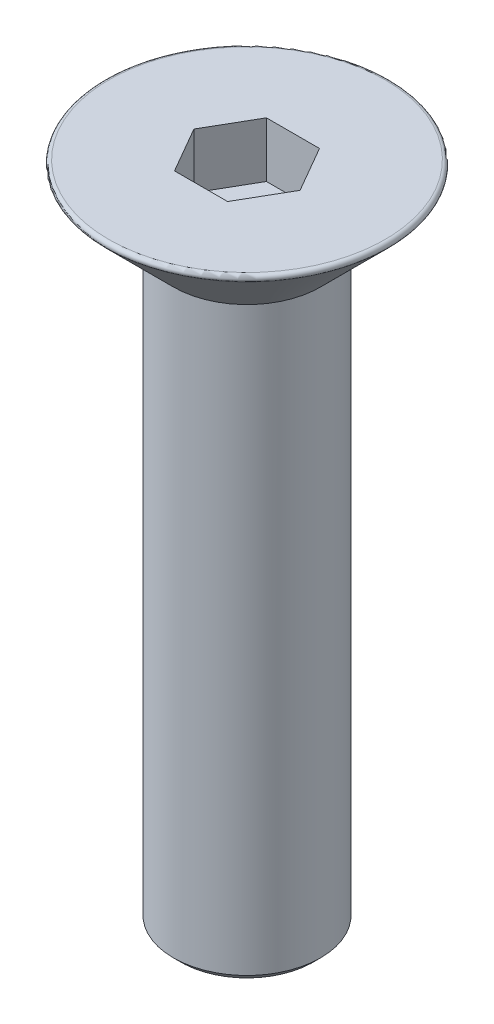
ISO-10303-21;
HEADER;
FILE_DESCRIPTION(('STEP AP214'),'2;1');
FILE_NAME('part.step','',(''),(''),'','','');
FILE_SCHEMA(('AUTOMOTIVE_DESIGN { 1 0 10303 214 1 1 1 1 }'));
ENDSEC;
DATA;
#1=APPLICATION_CONTEXT('core data for automotive mechanical design processes');
#2=APPLICATION_PROTOCOL_DEFINITION('international standard','automotive_design',2000,#1);
#3=PRODUCT_CONTEXT('',#1,'mechanical');
#4=PRODUCT('Part','Part','',(#3));
#5=PRODUCT_RELATED_PRODUCT_CATEGORY('part','',(#4));
#6=PRODUCT_DEFINITION_FORMATION('','',#4);
#7=PRODUCT_DEFINITION_CONTEXT('part definition',#1,'design');
#8=PRODUCT_DEFINITION('design','',#6,#7);
#9=PRODUCT_DEFINITION_SHAPE('','',#8);
#10=(LENGTH_UNIT() NAMED_UNIT(*) SI_UNIT(.MILLI.,.METRE.));
#11=(NAMED_UNIT(*) PLANE_ANGLE_UNIT() SI_UNIT($,.RADIAN.));
#12=(NAMED_UNIT(*) SI_UNIT($,.STERADIAN.) SOLID_ANGLE_UNIT());
#13=UNCERTAINTY_MEASURE_WITH_UNIT(LENGTH_MEASURE(1.E-05),#10,'distance_accuracy_value','');
#14=(GEOMETRIC_REPRESENTATION_CONTEXT(3) GLOBAL_UNCERTAINTY_ASSIGNED_CONTEXT((#13)) GLOBAL_UNIT_ASSIGNED_CONTEXT((#10,
#11,#12)) REPRESENTATION_CONTEXT('',''));
#15=CARTESIAN_POINT('',(0.,0.,0.));
#16=DIRECTION('',(0.,0.,1.));
#17=DIRECTION('',(1.,0.,0.));
#18=AXIS2_PLACEMENT_3D('',#15,#16,#17);
#19=CARTESIAN_POINT('',(0.,0.,0.));
#20=DIRECTION('',(0.,-1.,0.));
#21=DIRECTION('',(0.,0.,-1.));
#22=AXIS2_PLACEMENT_3D('',#19,#20,#21);
#23=PLANE('',#22);
#24=CARTESIAN_POINT('',(0.,0.,0.));
#25=DIRECTION('',(0.,-1.,0.));
#26=DIRECTION('',(0.,0.,-1.));
#27=AXIS2_PLACEMENT_3D('',#24,#25,#26);
#28=CIRCLE('',#27,1.8);
#29=CARTESIAN_POINT('',(0.,0.,-1.8));
#30=VERTEX_POINT('',#29);
#31=EDGE_CURVE('E11',#30,#30,#28,.T.);
#32=ORIENTED_EDGE('',*,*,#31,.T.);
#33=EDGE_LOOP('',(#32));
#34=FACE_BOUND('',#33,.T.);
#35=ADVANCED_FACE('F17',(#34),#23,.T.);
#36=CARTESIAN_POINT('',(0.,50.9004739336492,0.));
#37=DIRECTION('',(0.,1.,0.));
#38=DIRECTION('',(0.,0.,1.));
#39=AXIS2_PLACEMENT_3D('',#36,#37,#38);
#40=CYLINDRICAL_SURFACE('',#39,2.);
#41=CARTESIAN_POINT('',(0.,0.2,0.));
#42=DIRECTION('',(0.,-1.,0.));
#43=DIRECTION('',(0.,0.,-1.));
#44=AXIS2_PLACEMENT_3D('',#41,#42,#43);
#45=CIRCLE('',#44,2.);
#46=CARTESIAN_POINT('',(0.,0.2,-2.));
#47=VERTEX_POINT('',#46);
#48=EDGE_CURVE('E25',#47,#47,#45,.F.);
#49=ORIENTED_EDGE('',*,*,#48,.T.);
#50=EDGE_LOOP('',(#49));
#51=FACE_BOUND('',#50,.T.);
#52=CARTESIAN_POINT('',(0.,16.,0.));
#53=DIRECTION('',(0.,1.,0.));
#54=DIRECTION('',(0.,0.,1.));
#55=AXIS2_PLACEMENT_3D('',#52,#53,#54);
#56=CIRCLE('',#55,2.);
#57=CARTESIAN_POINT('',(0.,16.,2.));
#58=VERTEX_POINT('',#57);
#59=EDGE_CURVE('E119',#58,#58,#56,.T.);
#60=ORIENTED_EDGE('',*,*,#59,.F.);
#61=EDGE_LOOP('',(#60));
#62=FACE_BOUND('',#61,.T.);
#63=ADVANCED_FACE('F135',(#51,#62),#40,.T.);
#64=CARTESIAN_POINT('',(0.,18.,0.));
#65=DIRECTION('',(0.,1.,0.));
#66=DIRECTION('',(0.,0.,1.));
#67=AXIS2_PLACEMENT_3D('',#64,#65,#66);
#68=CONICAL_SURFACE('',#67,4.,0.78539816339745);
#69=CARTESIAN_POINT('',(0.,17.8292893218814,0.));
#70=DIRECTION('',(0.,-1.,0.));
#71=DIRECTION('',(0.,0.,-1.));
#72=AXIS2_PLACEMENT_3D('',#69,#70,#71);
#73=CIRCLE('',#72,3.82928932188134);
#74=CARTESIAN_POINT('',(0.,17.8292893218814,-3.82928932188134));
#75=VERTEX_POINT('',#74);
#76=EDGE_CURVE('E130',#75,#75,#73,.T.);
#77=ORIENTED_EDGE('',*,*,#76,.T.);
#78=EDGE_LOOP('',(#77));
#79=FACE_BOUND('',#78,.T.);
#80=ORIENTED_EDGE('',*,*,#59,.T.);
#81=EDGE_LOOP('',(#80));
#82=FACE_BOUND('',#81,.T.);
#83=ADVANCED_FACE('F160',(#79,#82),#68,.T.);
#84=CARTESIAN_POINT('',(-4.,18.,0.));
#85=DIRECTION('',(0.,1.,0.));
#86=DIRECTION('',(0.,0.,1.));
#87=AXIS2_PLACEMENT_3D('',#84,#85,#86);
#88=PLANE('',#87);
#89=DIRECTION('',(0.5,0.,-0.866025403784439));
#90=VECTOR('',#89,1.);
#91=CARTESIAN_POINT('',(0.721687836487033,18.,1.25));
#92=LINE('',#91,#90);
#93=CARTESIAN_POINT('',(0.721687836487033,18.,1.25));
#94=VERTEX_POINT('',#93);
#95=CARTESIAN_POINT('',(1.44337567297407,18.,0.));
#96=VERTEX_POINT('',#95);
#97=EDGE_CURVE('E32',#94,#96,#92,.T.);
#98=ORIENTED_EDGE('',*,*,#97,.F.);
#99=DIRECTION('',(1.,0.,0.));
#100=VECTOR('',#99,1.);
#101=CARTESIAN_POINT('',(-0.721687836487033,18.,1.25));
#102=LINE('',#101,#100);
#103=CARTESIAN_POINT('',(-0.721687836487033,18.,1.25));
#104=VERTEX_POINT('',#103);
#105=EDGE_CURVE('E115',#104,#94,#102,.T.);
#106=ORIENTED_EDGE('',*,*,#105,.F.);
#107=DIRECTION('',(0.5,0.,0.866025403784439));
#108=VECTOR('',#107,1.);
#109=CARTESIAN_POINT('',(-1.44337567297406,18.,0.));
#110=LINE('',#109,#108);
#111=CARTESIAN_POINT('',(-1.44337567297406,18.,0.));
#112=VERTEX_POINT('',#111);
#113=EDGE_CURVE('E113',#112,#104,#110,.T.);
#114=ORIENTED_EDGE('',*,*,#113,.F.);
#115=DIRECTION('',(-0.5,0.,0.866025403784439));
#116=VECTOR('',#115,1.);
#117=CARTESIAN_POINT('',(-0.721687836487033,18.,-1.25));
#118=LINE('',#117,#116);
#119=CARTESIAN_POINT('',(-0.721687836487033,18.,-1.25));
#120=VERTEX_POINT('',#119);
#121=EDGE_CURVE('E80',#120,#112,#118,.T.);
#122=ORIENTED_EDGE('',*,*,#121,.F.);
#123=DIRECTION('',(-1.,0.,0.));
#124=VECTOR('',#123,1.);
#125=CARTESIAN_POINT('',(0.721687836487032,18.,-1.25));
#126=LINE('',#125,#124);
#127=CARTESIAN_POINT('',(0.721687836487032,18.,-1.25));
#128=VERTEX_POINT('',#127);
#129=EDGE_CURVE('E109',#128,#120,#126,.T.);
#130=ORIENTED_EDGE('',*,*,#129,.F.);
#131=DIRECTION('',(-0.5,0.,-0.866025403784439));
#132=VECTOR('',#131,1.);
#133=CARTESIAN_POINT('',(1.44337567297406,18.,0.));
#134=LINE('',#133,#132);
#135=EDGE_CURVE('E106',#96,#128,#134,.T.);
#136=ORIENTED_EDGE('',*,*,#135,.F.);
#137=EDGE_LOOP('',(#98,#106,#114,#122,#130,#136));
#138=FACE_BOUND('',#137,.T.);
#139=CARTESIAN_POINT('',(0.,18.,0.));
#140=DIRECTION('',(0.,1.,0.));
#141=DIRECTION('',(0.,0.,1.));
#142=AXIS2_PLACEMENT_3D('',#139,#140,#141);
#143=CIRCLE('',#142,3.75857864376268);
#144=CARTESIAN_POINT('',(0.,18.,3.75857864376268));
#145=VERTEX_POINT('',#144);
#146=EDGE_CURVE('E127',#145,#145,#143,.T.);
#147=ORIENTED_EDGE('',*,*,#146,.T.);
#148=EDGE_LOOP('',(#147));
#149=FACE_BOUND('',#148,.T.);
#150=ADVANCED_FACE('F150',(#138,#149),#88,.T.);
#151=CARTESIAN_POINT('',(0.,17.9,0.));
#152=DIRECTION('',(0.,1.,0.));
#153=DIRECTION('',(0.,0.,1.));
#154=AXIS2_PLACEMENT_3D('',#151,#152,#153);
#155=TOROIDAL_SURFACE('',#154,3.75857864376268,0.1);
#156=ORIENTED_EDGE('',*,*,#76,.F.);
#157=EDGE_LOOP('',(#156));
#158=FACE_BOUND('',#157,.T.);
#159=ORIENTED_EDGE('',*,*,#146,.F.);
#160=EDGE_LOOP('',(#159));
#161=FACE_BOUND('',#160,.T.);
#162=ADVANCED_FACE('F140',(#158,#161),#155,.T.);
#163=CARTESIAN_POINT('',(0.,0.2,0.));
#164=DIRECTION('',(0.,1.,0.));
#165=DIRECTION('',(0.,0.,1.));
#166=AXIS2_PLACEMENT_3D('',#163,#164,#165);
#167=CONICAL_SURFACE('',#166,2.,0.785398163397455);
#168=ORIENTED_EDGE('',*,*,#31,.F.);
#169=EDGE_LOOP('',(#168));
#170=FACE_BOUND('',#169,.T.);
#171=ORIENTED_EDGE('',*,*,#48,.F.);
#172=EDGE_LOOP('',(#171));
#173=FACE_BOUND('',#172,.T.);
#174=ADVANCED_FACE('F19',(#170,#173),#167,.T.);
#175=CARTESIAN_POINT('',(0.721687836487033,16.5,1.25));
#176=DIRECTION('',(0.866025403784439,0.,0.5));
#177=DIRECTION('',(0.5,0.,-0.866025403784439));
#178=AXIS2_PLACEMENT_3D('',#175,#176,#177);
#179=PLANE('',#178);
#180=ORIENTED_EDGE('',*,*,#97,.T.);
#181=DIRECTION('',(0.,1.,0.));
#182=VECTOR('',#181,1.);
#183=CARTESIAN_POINT('',(1.44337567297406,16.5,0.));
#184=LINE('',#183,#182);
#185=CARTESIAN_POINT('',(1.44337567297406,16.5,0.));
#186=VERTEX_POINT('',#185);
#187=EDGE_CURVE('E62',#186,#96,#184,.T.);
#188=ORIENTED_EDGE('',*,*,#187,.F.);
#189=DIRECTION('',(0.5,0.,-0.866025403784439));
#190=VECTOR('',#189,1.);
#191=CARTESIAN_POINT('',(0.721687836487033,16.5,1.25));
#192=LINE('',#191,#190);
#193=CARTESIAN_POINT('',(0.721687836487033,16.5,1.25));
#194=VERTEX_POINT('',#193);
#195=EDGE_CURVE('E117',#194,#186,#192,.T.);
#196=ORIENTED_EDGE('',*,*,#195,.F.);
#197=DIRECTION('',(0.,1.,0.));
#198=VECTOR('',#197,1.);
#199=CARTESIAN_POINT('',(0.721687836487033,16.5,1.25));
#200=LINE('',#199,#198);
#201=EDGE_CURVE('E40',#194,#94,#200,.T.);
#202=ORIENTED_EDGE('',*,*,#201,.T.);
#203=EDGE_LOOP('',(#180,#188,#196,#202));
#204=FACE_BOUND('',#203,.T.);
#205=ADVANCED_FACE('F139',(#204),#179,.F.);
#206=CARTESIAN_POINT('',(-0.721687836487033,16.5,1.25));
#207=DIRECTION('',(0.,0.,1.));
#208=DIRECTION('',(1.,0.,0.));
#209=AXIS2_PLACEMENT_3D('',#206,#207,#208);
#210=PLANE('',#209);
#211=ORIENTED_EDGE('',*,*,#105,.T.);
#212=ORIENTED_EDGE('',*,*,#201,.F.);
#213=DIRECTION('',(1.,0.,0.));
#214=VECTOR('',#213,1.);
#215=CARTESIAN_POINT('',(-0.721687836487033,16.5,1.25));
#216=LINE('',#215,#214);
#217=CARTESIAN_POINT('',(-0.721687836487033,16.5,1.25));
#218=VERTEX_POINT('',#217);
#219=EDGE_CURVE('E92',#218,#194,#216,.T.);
#220=ORIENTED_EDGE('',*,*,#219,.F.);
#221=DIRECTION('',(0.,1.,0.));
#222=VECTOR('',#221,1.);
#223=CARTESIAN_POINT('',(-0.721687836487033,16.5,1.25));
#224=LINE('',#223,#222);
#225=EDGE_CURVE('E84',#218,#104,#224,.T.);
#226=ORIENTED_EDGE('',*,*,#225,.T.);
#227=EDGE_LOOP('',(#211,#212,#220,#226));
#228=FACE_BOUND('',#227,.T.);
#229=ADVANCED_FACE('F148',(#228),#210,.F.);
#230=CARTESIAN_POINT('',(-1.44337567297406,16.5,0.));
#231=DIRECTION('',(-0.866025403784439,0.,0.5));
#232=DIRECTION('',(0.5,0.,0.866025403784439));
#233=AXIS2_PLACEMENT_3D('',#230,#231,#232);
#234=PLANE('',#233);
#235=ORIENTED_EDGE('',*,*,#113,.T.);
#236=ORIENTED_EDGE('',*,*,#225,.F.);
#237=DIRECTION('',(0.5,0.,0.866025403784439));
#238=VECTOR('',#237,1.);
#239=CARTESIAN_POINT('',(-1.44337567297406,16.5,0.));
#240=LINE('',#239,#238);
#241=CARTESIAN_POINT('',(-1.44337567297406,16.5,0.));
#242=VERTEX_POINT('',#241);
#243=EDGE_CURVE('E88',#242,#218,#240,.T.);
#244=ORIENTED_EDGE('',*,*,#243,.F.);
#245=DIRECTION('',(0.,1.,0.));
#246=VECTOR('',#245,1.);
#247=CARTESIAN_POINT('',(-1.44337567297406,16.5,0.));
#248=LINE('',#247,#246);
#249=EDGE_CURVE('E73',#242,#112,#248,.T.);
#250=ORIENTED_EDGE('',*,*,#249,.T.);
#251=EDGE_LOOP('',(#235,#236,#244,#250));
#252=FACE_BOUND('',#251,.T.);
#253=ADVANCED_FACE('F89',(#252),#234,.F.);
#254=CARTESIAN_POINT('',(-0.721687836487033,16.5,-1.25));
#255=DIRECTION('',(-0.866025403784439,0.,-0.5));
#256=DIRECTION('',(-0.5,0.,0.866025403784439));
#257=AXIS2_PLACEMENT_3D('',#254,#255,#256);
#258=PLANE('',#257);
#259=ORIENTED_EDGE('',*,*,#121,.T.);
#260=ORIENTED_EDGE('',*,*,#249,.F.);
#261=DIRECTION('',(-0.5,0.,0.866025403784439));
#262=VECTOR('',#261,1.);
#263=CARTESIAN_POINT('',(-0.721687836487033,16.5,-1.25));
#264=LINE('',#263,#262);
#265=CARTESIAN_POINT('',(-0.721687836487033,16.5,-1.25));
#266=VERTEX_POINT('',#265);
#267=EDGE_CURVE('E77',#266,#242,#264,.T.);
#268=ORIENTED_EDGE('',*,*,#267,.F.);
#269=DIRECTION('',(0.,1.,0.));
#270=VECTOR('',#269,1.);
#271=CARTESIAN_POINT('',(-0.721687836487033,16.5,-1.25));
#272=LINE('',#271,#270);
#273=EDGE_CURVE('E85',#266,#120,#272,.T.);
#274=ORIENTED_EDGE('',*,*,#273,.T.);
#275=EDGE_LOOP('',(#259,#260,#268,#274));
#276=FACE_BOUND('',#275,.T.);
#277=ADVANCED_FACE('F75',(#276),#258,.F.);
#278=CARTESIAN_POINT('',(0.721687836487032,16.5,-1.25));
#279=DIRECTION('',(0.,0.,-1.));
#280=DIRECTION('',(-1.,0.,0.));
#281=AXIS2_PLACEMENT_3D('',#278,#279,#280);
#282=PLANE('',#281);
#283=ORIENTED_EDGE('',*,*,#129,.T.);
#284=ORIENTED_EDGE('',*,*,#273,.F.);
#285=DIRECTION('',(-1.,0.,0.));
#286=VECTOR('',#285,1.);
#287=CARTESIAN_POINT('',(0.721687836487032,16.5,-1.25));
#288=LINE('',#287,#286);
#289=CARTESIAN_POINT('',(0.721687836487032,16.5,-1.25));
#290=VERTEX_POINT('',#289);
#291=EDGE_CURVE('E98',#290,#266,#288,.T.);
#292=ORIENTED_EDGE('',*,*,#291,.F.);
#293=DIRECTION('',(0.,1.,0.));
#294=VECTOR('',#293,1.);
#295=CARTESIAN_POINT('',(0.721687836487032,16.5,-1.25));
#296=LINE('',#295,#294);
#297=EDGE_CURVE('E122',#290,#128,#296,.T.);
#298=ORIENTED_EDGE('',*,*,#297,.T.);
#299=EDGE_LOOP('',(#283,#284,#292,#298));
#300=FACE_BOUND('',#299,.T.);
#301=ADVANCED_FACE('F172',(#300),#282,.F.);
#302=CARTESIAN_POINT('',(1.44337567297406,16.5,0.));
#303=DIRECTION('',(0.866025403784439,0.,-0.5));
#304=DIRECTION('',(-0.5,0.,-0.866025403784439));
#305=AXIS2_PLACEMENT_3D('',#302,#303,#304);
#306=PLANE('',#305);
#307=ORIENTED_EDGE('',*,*,#135,.T.);
#308=ORIENTED_EDGE('',*,*,#297,.F.);
#309=DIRECTION('',(-0.5,0.,-0.866025403784439));
#310=VECTOR('',#309,1.);
#311=CARTESIAN_POINT('',(1.44337567297406,16.5,0.));
#312=LINE('',#311,#310);
#313=EDGE_CURVE('E100',#186,#290,#312,.T.);
#314=ORIENTED_EDGE('',*,*,#313,.F.);
#315=ORIENTED_EDGE('',*,*,#187,.T.);
#316=EDGE_LOOP('',(#307,#308,#314,#315));
#317=FACE_BOUND('',#316,.T.);
#318=ADVANCED_FACE('F169',(#317),#306,.F.);
#319=CARTESIAN_POINT('',(0.,16.5,0.));
#320=DIRECTION('',(0.,1.,0.));
#321=DIRECTION('',(0.,0.,1.));
#322=AXIS2_PLACEMENT_3D('',#319,#320,#321);
#323=PLANE('',#322);
#324=ORIENTED_EDGE('',*,*,#195,.T.);
#325=ORIENTED_EDGE('',*,*,#313,.T.);
#326=ORIENTED_EDGE('',*,*,#291,.T.);
#327=ORIENTED_EDGE('',*,*,#267,.T.);
#328=ORIENTED_EDGE('',*,*,#243,.T.);
#329=ORIENTED_EDGE('',*,*,#219,.T.);
#330=EDGE_LOOP('',(#324,#325,#326,#327,#328,#329));
#331=FACE_BOUND('',#330,.T.);
#332=ADVANCED_FACE('F95',(#331),#323,.T.);
#333=CLOSED_SHELL('',(#35,#63,#83,#150,#162,#174,#205,#229,#253,#277,#301,#318,#332));
#334=MANIFOLD_SOLID_BREP('B1',#333);
#335=ADVANCED_BREP_SHAPE_REPRESENTATION('',(#18,#334),#14);
#336=SHAPE_DEFINITION_REPRESENTATION(#9,#335);
ENDSEC;
END-ISO-10303-21;
